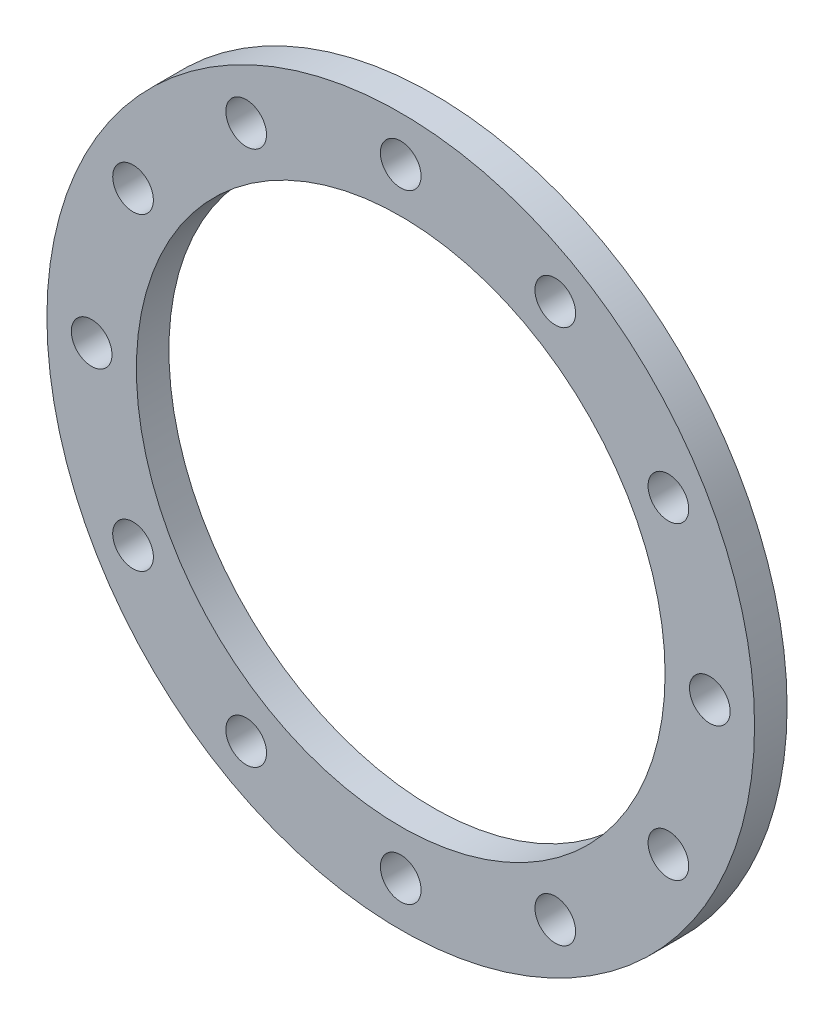
ISO-10303-21;
HEADER;
FILE_DESCRIPTION(('STEP AP214'),'2;1');
FILE_NAME('part.step','',(''),(''),'','','');
FILE_SCHEMA(('AUTOMOTIVE_DESIGN { 1 0 10303 214 1 1 1 1 }'));
ENDSEC;
DATA;
#1=APPLICATION_CONTEXT('core data for automotive mechanical design processes');
#2=APPLICATION_PROTOCOL_DEFINITION('international standard','automotive_design',2000,#1);
#3=PRODUCT_CONTEXT('',#1,'mechanical');
#4=PRODUCT('Part','Part','',(#3));
#5=PRODUCT_RELATED_PRODUCT_CATEGORY('part','',(#4));
#6=PRODUCT_DEFINITION_FORMATION('','',#4);
#7=PRODUCT_DEFINITION_CONTEXT('part definition',#1,'design');
#8=PRODUCT_DEFINITION('design','',#6,#7);
#9=PRODUCT_DEFINITION_SHAPE('','',#8);
#10=(LENGTH_UNIT() NAMED_UNIT(*) SI_UNIT(.MILLI.,.METRE.));
#11=(NAMED_UNIT(*) PLANE_ANGLE_UNIT() SI_UNIT($,.RADIAN.));
#12=(NAMED_UNIT(*) SI_UNIT($,.STERADIAN.) SOLID_ANGLE_UNIT());
#13=UNCERTAINTY_MEASURE_WITH_UNIT(LENGTH_MEASURE(1.E-05),#10,'distance_accuracy_value','');
#14=(GEOMETRIC_REPRESENTATION_CONTEXT(3) GLOBAL_UNCERTAINTY_ASSIGNED_CONTEXT((#13)) GLOBAL_UNIT_ASSIGNED_CONTEXT((#10,
#11,#12)) REPRESENTATION_CONTEXT('',''));
#15=CARTESIAN_POINT('',(0.,0.,0.));
#16=DIRECTION('',(0.,0.,1.));
#17=DIRECTION('',(1.,0.,0.));
#18=AXIS2_PLACEMENT_3D('',#15,#16,#17);
#19=CARTESIAN_POINT('',(0.,0.,4.));
#20=DIRECTION('',(0.,0.,1.));
#21=DIRECTION('',(1.,0.,0.));
#22=AXIS2_PLACEMENT_3D('',#19,#20,#21);
#23=PLANE('',#22);
#24=CARTESIAN_POINT('',(-32.9089653438087,18.9999999999999,4.));
#25=DIRECTION('',(0.,0.,1.));
#26=DIRECTION('',(0.499999999999998,0.86602540378444,0.));
#27=AXIS2_PLACEMENT_3D('',#24,#25,#26);
#28=CIRCLE('',#27,2.5);
#29=CARTESIAN_POINT('',(-31.6589653438087,21.165063509461,4.));
#30=VERTEX_POINT('',#29);
#31=EDGE_CURVE('E109',#30,#30,#28,.T.);
#32=ORIENTED_EDGE('',*,*,#31,.F.);
#33=EDGE_LOOP('',(#32));
#34=FACE_BOUND('',#33,.T.);
#35=CARTESIAN_POINT('',(-38.,-1.32676290876039E-13,4.));
#36=DIRECTION('',(0.,0.,1.));
#37=DIRECTION('',(0.,1.,0.));
#38=AXIS2_PLACEMENT_3D('',#35,#36,#37);
#39=CIRCLE('',#38,2.5);
#40=CARTESIAN_POINT('',(-38.,2.49999999999987,4.));
#41=VERTEX_POINT('',#40);
#42=EDGE_CURVE('E103',#41,#41,#39,.T.);
#43=ORIENTED_EDGE('',*,*,#42,.F.);
#44=EDGE_LOOP('',(#43));
#45=FACE_BOUND('',#44,.T.);
#46=CARTESIAN_POINT('',(-32.9089653438086,-19.0000000000002,4.));
#47=DIRECTION('',(0.,0.,1.));
#48=DIRECTION('',(-0.500000000000004,0.866025403784436,0.));
#49=AXIS2_PLACEMENT_3D('',#46,#47,#48);
#50=CIRCLE('',#49,2.5);
#51=CARTESIAN_POINT('',(-34.1589653438086,-16.8349364905391,4.));
#52=VERTEX_POINT('',#51);
#53=EDGE_CURVE('E97',#52,#52,#50,.T.);
#54=ORIENTED_EDGE('',*,*,#53,.F.);
#55=EDGE_LOOP('',(#54));
#56=FACE_BOUND('',#55,.T.);
#57=CARTESIAN_POINT('',(-18.9999999999998,-32.9089653438088,4.));
#58=DIRECTION('',(0.,0.,1.));
#59=DIRECTION('',(-0.866025403784442,0.499999999999995,0.));
#60=AXIS2_PLACEMENT_3D('',#57,#58,#59);
#61=CIRCLE('',#60,2.5);
#62=CARTESIAN_POINT('',(-21.1650635094609,-31.6589653438088,4.));
#63=VERTEX_POINT('',#62);
#64=EDGE_CURVE('E91',#63,#63,#61,.T.);
#65=ORIENTED_EDGE('',*,*,#64,.F.);
#66=EDGE_LOOP('',(#65));
#67=FACE_BOUND('',#66,.T.);
#68=CARTESIAN_POINT('',(0.,-38.,4.));
#69=DIRECTION('',(0.,0.,1.));
#70=DIRECTION('',(-1.,0.,0.));
#71=AXIS2_PLACEMENT_3D('',#68,#69,#70);
#72=CIRCLE('',#71,2.5);
#73=CARTESIAN_POINT('',(-2.5,-38.,4.));
#74=VERTEX_POINT('',#73);
#75=EDGE_CURVE('E85',#74,#74,#72,.T.);
#76=ORIENTED_EDGE('',*,*,#75,.F.);
#77=EDGE_LOOP('',(#76));
#78=FACE_BOUND('',#77,.T.);
#79=CARTESIAN_POINT('',(19.0000000000003,-32.9089653438085,4.));
#80=DIRECTION('',(0.,0.,1.));
#81=DIRECTION('',(-0.866025403784435,-0.500000000000007,0.));
#82=AXIS2_PLACEMENT_3D('',#79,#80,#81);
#83=CIRCLE('',#82,2.5);
#84=CARTESIAN_POINT('',(16.8349364905392,-34.1589653438085,4.));
#85=VERTEX_POINT('',#84);
#86=EDGE_CURVE('E79',#85,#85,#83,.T.);
#87=ORIENTED_EDGE('',*,*,#86,.F.);
#88=EDGE_LOOP('',(#87));
#89=FACE_BOUND('',#88,.T.);
#90=CARTESIAN_POINT('',(32.9089653438088,-18.9999999999997,4.));
#91=DIRECTION('',(0.,0.,1.));
#92=DIRECTION('',(-0.499999999999992,-0.866025403784443,0.));
#93=AXIS2_PLACEMENT_3D('',#90,#91,#92);
#94=CIRCLE('',#93,2.5);
#95=CARTESIAN_POINT('',(31.6589653438089,-21.1650635094608,4.));
#96=VERTEX_POINT('',#95);
#97=EDGE_CURVE('E73',#96,#96,#94,.T.);
#98=ORIENTED_EDGE('',*,*,#97,.F.);
#99=EDGE_LOOP('',(#98));
#100=FACE_BOUND('',#99,.T.);
#101=CARTESIAN_POINT('',(38.,3.98028872628117E-13,4.));
#102=DIRECTION('',(0.,0.,1.));
#103=DIRECTION('',(0.,-1.,0.));
#104=AXIS2_PLACEMENT_3D('',#101,#102,#103);
#105=CIRCLE('',#104,2.5);
#106=CARTESIAN_POINT('',(38.,-2.4999999999996,4.));
#107=VERTEX_POINT('',#106);
#108=EDGE_CURVE('E66',#107,#107,#105,.T.);
#109=ORIENTED_EDGE('',*,*,#108,.F.);
#110=EDGE_LOOP('',(#109));
#111=FACE_BOUND('',#110,.T.);
#112=CARTESIAN_POINT('',(32.9089653438084,19.0000000000004,4.));
#113=DIRECTION('',(0.,0.,1.));
#114=DIRECTION('',(0.50000000000001,-0.866025403784433,0.));
#115=AXIS2_PLACEMENT_3D('',#112,#113,#114);
#116=CIRCLE('',#115,2.5);
#117=CARTESIAN_POINT('',(34.1589653438085,16.8349364905393,4.));
#118=VERTEX_POINT('',#117);
#119=EDGE_CURVE('E120',#118,#118,#116,.T.);
#120=ORIENTED_EDGE('',*,*,#119,.F.);
#121=EDGE_LOOP('',(#120));
#122=FACE_BOUND('',#121,.T.);
#123=CARTESIAN_POINT('',(18.9999999999996,32.9089653438089,4.));
#124=DIRECTION('',(0.,0.,1.));
#125=DIRECTION('',(0.866025403784445,-0.499999999999989,0.));
#126=AXIS2_PLACEMENT_3D('',#123,#124,#125);
#127=CIRCLE('',#126,2.5);
#128=CARTESIAN_POINT('',(21.1650635094607,31.6589653438089,4.));
#129=VERTEX_POINT('',#128);
#130=EDGE_CURVE('E114',#129,#129,#127,.T.);
#131=ORIENTED_EDGE('',*,*,#130,.F.);
#132=EDGE_LOOP('',(#131));
#133=FACE_BOUND('',#132,.T.);
#134=CARTESIAN_POINT('',(-19.,32.9089653438086,4.));
#135=DIRECTION('',(0.,0.,1.));
#136=DIRECTION('',(0.866025403784438,0.500000000000001,0.));
#137=AXIS2_PLACEMENT_3D('',#134,#135,#136);
#138=CIRCLE('',#137,2.5);
#139=CARTESIAN_POINT('',(-16.8349364905389,34.1589653438086,4.));
#140=VERTEX_POINT('',#139);
#141=EDGE_CURVE('E60',#140,#140,#138,.T.);
#142=ORIENTED_EDGE('',*,*,#141,.F.);
#143=EDGE_LOOP('',(#142));
#144=FACE_BOUND('',#143,.T.);
#145=CARTESIAN_POINT('',(0.,38.,4.));
#146=DIRECTION('',(0.,0.,1.));
#147=DIRECTION('',(1.,0.,0.));
#148=AXIS2_PLACEMENT_3D('',#145,#146,#147);
#149=CIRCLE('',#148,2.5);
#150=CARTESIAN_POINT('',(2.5,38.,4.));
#151=VERTEX_POINT('',#150);
#152=EDGE_CURVE('E54',#151,#151,#149,.T.);
#153=ORIENTED_EDGE('',*,*,#152,.F.);
#154=EDGE_LOOP('',(#153));
#155=FACE_BOUND('',#154,.T.);
#156=CARTESIAN_POINT('',(0.,0.,4.));
#157=DIRECTION('',(0.,0.,1.));
#158=DIRECTION('',(1.,0.,0.));
#159=AXIS2_PLACEMENT_3D('',#156,#157,#158);
#160=CIRCLE('',#159,43.5);
#161=CARTESIAN_POINT('',(43.5,0.,4.));
#162=VERTEX_POINT('',#161);
#163=EDGE_CURVE('E10',#162,#162,#160,.T.);
#164=ORIENTED_EDGE('',*,*,#163,.T.);
#165=EDGE_LOOP('',(#164));
#166=FACE_BOUND('',#165,.T.);
#167=CARTESIAN_POINT('',(0.,0.,4.));
#168=DIRECTION('',(0.,0.,1.));
#169=DIRECTION('',(1.,0.,0.));
#170=AXIS2_PLACEMENT_3D('',#167,#168,#169);
#171=CIRCLE('',#170,32.5);
#172=CARTESIAN_POINT('',(32.5,0.,4.));
#173=VERTEX_POINT('',#172);
#174=EDGE_CURVE('E46',#173,#173,#171,.T.);
#175=ORIENTED_EDGE('',*,*,#174,.F.);
#176=EDGE_LOOP('',(#175));
#177=FACE_BOUND('',#176,.T.);
#178=ADVANCED_FACE('F35',(#34,#45,#56,#67,#78,#89,#100,#111,#122,#133,#144,#155,#166,#177),#23,.T.);
#179=CARTESIAN_POINT('',(0.,0.,0.));
#180=DIRECTION('',(0.,0.,1.));
#181=DIRECTION('',(1.,0.,0.));
#182=AXIS2_PLACEMENT_3D('',#179,#180,#181);
#183=PLANE('',#182);
#184=CARTESIAN_POINT('',(-32.9089653438087,18.9999999999999,0.));
#185=DIRECTION('',(0.,0.,1.));
#186=DIRECTION('',(0.499999999999998,0.86602540378444,0.));
#187=AXIS2_PLACEMENT_3D('',#184,#185,#186);
#188=CIRCLE('',#187,2.5);
#189=CARTESIAN_POINT('',(-31.6589653438087,21.165063509461,0.));
#190=VERTEX_POINT('',#189);
#191=EDGE_CURVE('E63',#190,#190,#188,.T.);
#192=ORIENTED_EDGE('',*,*,#191,.T.);
#193=EDGE_LOOP('',(#192));
#194=FACE_BOUND('',#193,.T.);
#195=CARTESIAN_POINT('',(-38.,-1.32676290876039E-13,0.));
#196=DIRECTION('',(0.,0.,1.));
#197=DIRECTION('',(0.,1.,0.));
#198=AXIS2_PLACEMENT_3D('',#195,#196,#197);
#199=CIRCLE('',#198,2.5);
#200=CARTESIAN_POINT('',(-38.,2.49999999999987,0.));
#201=VERTEX_POINT('',#200);
#202=EDGE_CURVE('E106',#201,#201,#199,.T.);
#203=ORIENTED_EDGE('',*,*,#202,.T.);
#204=EDGE_LOOP('',(#203));
#205=FACE_BOUND('',#204,.T.);
#206=CARTESIAN_POINT('',(-32.9089653438086,-19.0000000000002,0.));
#207=DIRECTION('',(0.,0.,1.));
#208=DIRECTION('',(-0.500000000000004,0.866025403784436,0.));
#209=AXIS2_PLACEMENT_3D('',#206,#207,#208);
#210=CIRCLE('',#209,2.5);
#211=CARTESIAN_POINT('',(-34.1589653438086,-16.8349364905391,0.));
#212=VERTEX_POINT('',#211);
#213=EDGE_CURVE('E100',#212,#212,#210,.T.);
#214=ORIENTED_EDGE('',*,*,#213,.T.);
#215=EDGE_LOOP('',(#214));
#216=FACE_BOUND('',#215,.T.);
#217=CARTESIAN_POINT('',(-18.9999999999998,-32.9089653438088,0.));
#218=DIRECTION('',(0.,0.,1.));
#219=DIRECTION('',(-0.866025403784442,0.499999999999995,0.));
#220=AXIS2_PLACEMENT_3D('',#217,#218,#219);
#221=CIRCLE('',#220,2.5);
#222=CARTESIAN_POINT('',(-21.1650635094609,-31.6589653438088,0.));
#223=VERTEX_POINT('',#222);
#224=EDGE_CURVE('E94',#223,#223,#221,.T.);
#225=ORIENTED_EDGE('',*,*,#224,.T.);
#226=EDGE_LOOP('',(#225));
#227=FACE_BOUND('',#226,.T.);
#228=CARTESIAN_POINT('',(0.,-38.,0.));
#229=DIRECTION('',(0.,0.,1.));
#230=DIRECTION('',(-1.,0.,0.));
#231=AXIS2_PLACEMENT_3D('',#228,#229,#230);
#232=CIRCLE('',#231,2.5);
#233=CARTESIAN_POINT('',(-2.5,-38.,0.));
#234=VERTEX_POINT('',#233);
#235=EDGE_CURVE('E88',#234,#234,#232,.T.);
#236=ORIENTED_EDGE('',*,*,#235,.T.);
#237=EDGE_LOOP('',(#236));
#238=FACE_BOUND('',#237,.T.);
#239=CARTESIAN_POINT('',(19.0000000000003,-32.9089653438085,0.));
#240=DIRECTION('',(0.,0.,1.));
#241=DIRECTION('',(-0.866025403784435,-0.500000000000007,0.));
#242=AXIS2_PLACEMENT_3D('',#239,#240,#241);
#243=CIRCLE('',#242,2.5);
#244=CARTESIAN_POINT('',(16.8349364905392,-34.1589653438085,0.));
#245=VERTEX_POINT('',#244);
#246=EDGE_CURVE('E82',#245,#245,#243,.T.);
#247=ORIENTED_EDGE('',*,*,#246,.T.);
#248=EDGE_LOOP('',(#247));
#249=FACE_BOUND('',#248,.T.);
#250=CARTESIAN_POINT('',(32.9089653438088,-18.9999999999997,0.));
#251=DIRECTION('',(0.,0.,1.));
#252=DIRECTION('',(-0.499999999999992,-0.866025403784443,0.));
#253=AXIS2_PLACEMENT_3D('',#250,#251,#252);
#254=CIRCLE('',#253,2.5);
#255=CARTESIAN_POINT('',(31.6589653438089,-21.1650635094608,0.));
#256=VERTEX_POINT('',#255);
#257=EDGE_CURVE('E76',#256,#256,#254,.T.);
#258=ORIENTED_EDGE('',*,*,#257,.T.);
#259=EDGE_LOOP('',(#258));
#260=FACE_BOUND('',#259,.T.);
#261=CARTESIAN_POINT('',(38.,3.98028872628117E-13,0.));
#262=DIRECTION('',(0.,0.,1.));
#263=DIRECTION('',(0.,-1.,0.));
#264=AXIS2_PLACEMENT_3D('',#261,#262,#263);
#265=CIRCLE('',#264,2.5);
#266=CARTESIAN_POINT('',(38.,-2.4999999999996,0.));
#267=VERTEX_POINT('',#266);
#268=EDGE_CURVE('E69',#267,#267,#265,.T.);
#269=ORIENTED_EDGE('',*,*,#268,.T.);
#270=EDGE_LOOP('',(#269));
#271=FACE_BOUND('',#270,.T.);
#272=CARTESIAN_POINT('',(32.9089653438084,19.0000000000004,0.));
#273=DIRECTION('',(0.,0.,1.));
#274=DIRECTION('',(0.50000000000001,-0.866025403784433,0.));
#275=AXIS2_PLACEMENT_3D('',#272,#273,#274);
#276=CIRCLE('',#275,2.5);
#277=CARTESIAN_POINT('',(34.1589653438085,16.8349364905393,0.));
#278=VERTEX_POINT('',#277);
#279=EDGE_CURVE('E70',#278,#278,#276,.T.);
#280=ORIENTED_EDGE('',*,*,#279,.T.);
#281=EDGE_LOOP('',(#280));
#282=FACE_BOUND('',#281,.T.);
#283=CARTESIAN_POINT('',(18.9999999999996,32.9089653438089,0.));
#284=DIRECTION('',(0.,0.,1.));
#285=DIRECTION('',(0.866025403784445,-0.499999999999989,0.));
#286=AXIS2_PLACEMENT_3D('',#283,#284,#285);
#287=CIRCLE('',#286,2.5);
#288=CARTESIAN_POINT('',(21.1650635094607,31.6589653438089,0.));
#289=VERTEX_POINT('',#288);
#290=EDGE_CURVE('E117',#289,#289,#287,.T.);
#291=ORIENTED_EDGE('',*,*,#290,.T.);
#292=EDGE_LOOP('',(#291));
#293=FACE_BOUND('',#292,.T.);
#294=CARTESIAN_POINT('',(-19.,32.9089653438086,0.));
#295=DIRECTION('',(0.,0.,1.));
#296=DIRECTION('',(0.866025403784438,0.500000000000001,0.));
#297=AXIS2_PLACEMENT_3D('',#294,#295,#296);
#298=CIRCLE('',#297,2.5);
#299=CARTESIAN_POINT('',(-16.8349364905389,34.1589653438086,0.));
#300=VERTEX_POINT('',#299);
#301=EDGE_CURVE('E57',#300,#300,#298,.T.);
#302=ORIENTED_EDGE('',*,*,#301,.T.);
#303=EDGE_LOOP('',(#302));
#304=FACE_BOUND('',#303,.T.);
#305=CARTESIAN_POINT('',(0.,38.,0.));
#306=DIRECTION('',(0.,0.,1.));
#307=DIRECTION('',(1.,0.,0.));
#308=AXIS2_PLACEMENT_3D('',#305,#306,#307);
#309=CIRCLE('',#308,2.5);
#310=CARTESIAN_POINT('',(2.5,38.,0.));
#311=VERTEX_POINT('',#310);
#312=EDGE_CURVE('E51',#311,#311,#309,.T.);
#313=ORIENTED_EDGE('',*,*,#312,.T.);
#314=EDGE_LOOP('',(#313));
#315=FACE_BOUND('',#314,.T.);
#316=CARTESIAN_POINT('',(0.,0.,0.));
#317=DIRECTION('',(0.,0.,1.));
#318=DIRECTION('',(1.,0.,0.));
#319=AXIS2_PLACEMENT_3D('',#316,#317,#318);
#320=CIRCLE('',#319,43.5);
#321=CARTESIAN_POINT('',(43.5,0.,0.));
#322=VERTEX_POINT('',#321);
#323=EDGE_CURVE('E39',#322,#322,#320,.T.);
#324=ORIENTED_EDGE('',*,*,#323,.F.);
#325=EDGE_LOOP('',(#324));
#326=FACE_BOUND('',#325,.T.);
#327=CARTESIAN_POINT('',(0.,0.,0.));
#328=DIRECTION('',(0.,0.,1.));
#329=DIRECTION('',(1.,0.,0.));
#330=AXIS2_PLACEMENT_3D('',#327,#328,#329);
#331=CIRCLE('',#330,32.5);
#332=CARTESIAN_POINT('',(32.5,0.,0.));
#333=VERTEX_POINT('',#332);
#334=EDGE_CURVE('E48',#333,#333,#331,.T.);
#335=ORIENTED_EDGE('',*,*,#334,.T.);
#336=EDGE_LOOP('',(#335));
#337=FACE_BOUND('',#336,.T.);
#338=ADVANCED_FACE('F126',(#194,#205,#216,#227,#238,#249,#260,#271,#282,#293,#304,#315,#326,
#337),#183,.F.);
#339=CARTESIAN_POINT('',(0.,0.,4.));
#340=DIRECTION('',(0.,0.,-1.));
#341=DIRECTION('',(-1.,0.,0.));
#342=AXIS2_PLACEMENT_3D('',#339,#340,#341);
#343=CYLINDRICAL_SURFACE('',#342,43.5);
#344=ORIENTED_EDGE('',*,*,#163,.F.);
#345=EDGE_LOOP('',(#344));
#346=FACE_BOUND('',#345,.T.);
#347=ORIENTED_EDGE('',*,*,#323,.T.);
#348=EDGE_LOOP('',(#347));
#349=FACE_BOUND('',#348,.T.);
#350=ADVANCED_FACE('F37',(#346,#349),#343,.T.);
#351=CARTESIAN_POINT('',(0.,0.,4.));
#352=DIRECTION('',(0.,0.,-1.));
#353=DIRECTION('',(-1.,0.,0.));
#354=AXIS2_PLACEMENT_3D('',#351,#352,#353);
#355=CYLINDRICAL_SURFACE('',#354,32.5);
#356=ORIENTED_EDGE('',*,*,#174,.T.);
#357=EDGE_LOOP('',(#356));
#358=FACE_BOUND('',#357,.T.);
#359=ORIENTED_EDGE('',*,*,#334,.F.);
#360=EDGE_LOOP('',(#359));
#361=FACE_BOUND('',#360,.T.);
#362=ADVANCED_FACE('F149',(#358,#361),#355,.F.);
#363=CARTESIAN_POINT('',(0.,38.,0.));
#364=DIRECTION('',(0.,0.,1.));
#365=DIRECTION('',(1.,0.,0.));
#366=AXIS2_PLACEMENT_3D('',#363,#364,#365);
#367=CYLINDRICAL_SURFACE('',#366,2.5);
#368=ORIENTED_EDGE('',*,*,#312,.F.);
#369=EDGE_LOOP('',(#368));
#370=FACE_BOUND('',#369,.T.);
#371=ORIENTED_EDGE('',*,*,#152,.T.);
#372=EDGE_LOOP('',(#371));
#373=FACE_BOUND('',#372,.T.);
#374=ADVANCED_FACE('F152',(#370,#373),#367,.F.);
#375=CARTESIAN_POINT('',(-19.,32.9089653438086,0.));
#376=DIRECTION('',(0.,0.,1.));
#377=DIRECTION('',(1.,0.,0.));
#378=AXIS2_PLACEMENT_3D('',#375,#376,#377);
#379=CYLINDRICAL_SURFACE('',#378,2.5);
#380=ORIENTED_EDGE('',*,*,#301,.F.);
#381=EDGE_LOOP('',(#380));
#382=FACE_BOUND('',#381,.T.);
#383=ORIENTED_EDGE('',*,*,#141,.T.);
#384=EDGE_LOOP('',(#383));
#385=FACE_BOUND('',#384,.T.);
#386=ADVANCED_FACE('F166',(#382,#385),#379,.F.);
#387=CARTESIAN_POINT('',(18.9999999999996,32.9089653438089,0.));
#388=DIRECTION('',(0.,0.,1.));
#389=DIRECTION('',(1.,0.,0.));
#390=AXIS2_PLACEMENT_3D('',#387,#388,#389);
#391=CYLINDRICAL_SURFACE('',#390,2.5);
#392=ORIENTED_EDGE('',*,*,#290,.F.);
#393=EDGE_LOOP('',(#392));
#394=FACE_BOUND('',#393,.T.);
#395=ORIENTED_EDGE('',*,*,#130,.T.);
#396=EDGE_LOOP('',(#395));
#397=FACE_BOUND('',#396,.T.);
#398=ADVANCED_FACE('F133',(#394,#397),#391,.F.);
#399=CARTESIAN_POINT('',(32.9089653438084,19.0000000000004,0.));
#400=DIRECTION('',(0.,0.,1.));
#401=DIRECTION('',(1.,0.,0.));
#402=AXIS2_PLACEMENT_3D('',#399,#400,#401);
#403=CYLINDRICAL_SURFACE('',#402,2.5);
#404=ORIENTED_EDGE('',*,*,#279,.F.);
#405=EDGE_LOOP('',(#404));
#406=FACE_BOUND('',#405,.T.);
#407=ORIENTED_EDGE('',*,*,#119,.T.);
#408=EDGE_LOOP('',(#407));
#409=FACE_BOUND('',#408,.T.);
#410=ADVANCED_FACE('F129',(#406,#409),#403,.F.);
#411=CARTESIAN_POINT('',(38.,3.98028872628117E-13,0.));
#412=DIRECTION('',(0.,0.,1.));
#413=DIRECTION('',(1.,0.,0.));
#414=AXIS2_PLACEMENT_3D('',#411,#412,#413);
#415=CYLINDRICAL_SURFACE('',#414,2.5);
#416=ORIENTED_EDGE('',*,*,#268,.F.);
#417=EDGE_LOOP('',(#416));
#418=FACE_BOUND('',#417,.T.);
#419=ORIENTED_EDGE('',*,*,#108,.T.);
#420=EDGE_LOOP('',(#419));
#421=FACE_BOUND('',#420,.T.);
#422=ADVANCED_FACE('F132',(#418,#421),#415,.F.);
#423=CARTESIAN_POINT('',(32.9089653438088,-18.9999999999997,0.));
#424=DIRECTION('',(0.,0.,1.));
#425=DIRECTION('',(1.,0.,0.));
#426=AXIS2_PLACEMENT_3D('',#423,#424,#425);
#427=CYLINDRICAL_SURFACE('',#426,2.5);
#428=ORIENTED_EDGE('',*,*,#257,.F.);
#429=EDGE_LOOP('',(#428));
#430=FACE_BOUND('',#429,.T.);
#431=ORIENTED_EDGE('',*,*,#97,.T.);
#432=EDGE_LOOP('',(#431));
#433=FACE_BOUND('',#432,.T.);
#434=ADVANCED_FACE('F173',(#430,#433),#427,.F.);
#435=CARTESIAN_POINT('',(19.0000000000003,-32.9089653438085,0.));
#436=DIRECTION('',(0.,0.,1.));
#437=DIRECTION('',(1.,0.,0.));
#438=AXIS2_PLACEMENT_3D('',#435,#436,#437);
#439=CYLINDRICAL_SURFACE('',#438,2.5);
#440=ORIENTED_EDGE('',*,*,#246,.F.);
#441=EDGE_LOOP('',(#440));
#442=FACE_BOUND('',#441,.T.);
#443=ORIENTED_EDGE('',*,*,#86,.T.);
#444=EDGE_LOOP('',(#443));
#445=FACE_BOUND('',#444,.T.);
#446=ADVANCED_FACE('F177',(#442,#445),#439,.F.);
#447=CARTESIAN_POINT('',(0.,-38.,0.));
#448=DIRECTION('',(0.,0.,1.));
#449=DIRECTION('',(1.,0.,0.));
#450=AXIS2_PLACEMENT_3D('',#447,#448,#449);
#451=CYLINDRICAL_SURFACE('',#450,2.5);
#452=ORIENTED_EDGE('',*,*,#235,.F.);
#453=EDGE_LOOP('',(#452));
#454=FACE_BOUND('',#453,.T.);
#455=ORIENTED_EDGE('',*,*,#75,.T.);
#456=EDGE_LOOP('',(#455));
#457=FACE_BOUND('',#456,.T.);
#458=ADVANCED_FACE('F181',(#454,#457),#451,.F.);
#459=CARTESIAN_POINT('',(-18.9999999999998,-32.9089653438088,0.));
#460=DIRECTION('',(0.,0.,1.));
#461=DIRECTION('',(1.,0.,0.));
#462=AXIS2_PLACEMENT_3D('',#459,#460,#461);
#463=CYLINDRICAL_SURFACE('',#462,2.5);
#464=ORIENTED_EDGE('',*,*,#224,.F.);
#465=EDGE_LOOP('',(#464));
#466=FACE_BOUND('',#465,.T.);
#467=ORIENTED_EDGE('',*,*,#64,.T.);
#468=EDGE_LOOP('',(#467));
#469=FACE_BOUND('',#468,.T.);
#470=ADVANCED_FACE('F185',(#466,#469),#463,.F.);
#471=CARTESIAN_POINT('',(-32.9089653438086,-19.0000000000002,0.));
#472=DIRECTION('',(0.,0.,1.));
#473=DIRECTION('',(1.,0.,0.));
#474=AXIS2_PLACEMENT_3D('',#471,#472,#473);
#475=CYLINDRICAL_SURFACE('',#474,2.5);
#476=ORIENTED_EDGE('',*,*,#213,.F.);
#477=EDGE_LOOP('',(#476));
#478=FACE_BOUND('',#477,.T.);
#479=ORIENTED_EDGE('',*,*,#53,.T.);
#480=EDGE_LOOP('',(#479));
#481=FACE_BOUND('',#480,.T.);
#482=ADVANCED_FACE('F189',(#478,#481),#475,.F.);
#483=CARTESIAN_POINT('',(-38.,-1.32676290876039E-13,0.));
#484=DIRECTION('',(0.,0.,1.));
#485=DIRECTION('',(1.,0.,0.));
#486=AXIS2_PLACEMENT_3D('',#483,#484,#485);
#487=CYLINDRICAL_SURFACE('',#486,2.5);
#488=ORIENTED_EDGE('',*,*,#202,.F.);
#489=EDGE_LOOP('',(#488));
#490=FACE_BOUND('',#489,.T.);
#491=ORIENTED_EDGE('',*,*,#42,.T.);
#492=EDGE_LOOP('',(#491));
#493=FACE_BOUND('',#492,.T.);
#494=ADVANCED_FACE('F193',(#490,#493),#487,.F.);
#495=CARTESIAN_POINT('',(-32.9089653438087,18.9999999999999,0.));
#496=DIRECTION('',(0.,0.,1.));
#497=DIRECTION('',(1.,0.,0.));
#498=AXIS2_PLACEMENT_3D('',#495,#496,#497);
#499=CYLINDRICAL_SURFACE('',#498,2.5);
#500=ORIENTED_EDGE('',*,*,#191,.F.);
#501=EDGE_LOOP('',(#500));
#502=FACE_BOUND('',#501,.T.);
#503=ORIENTED_EDGE('',*,*,#31,.T.);
#504=EDGE_LOOP('',(#503));
#505=FACE_BOUND('',#504,.T.);
#506=ADVANCED_FACE('F197',(#502,#505),#499,.F.);
#507=CLOSED_SHELL('',(#178,#338,#350,#362,#374,#386,#398,#410,#422,#434,#446,#458,#470,#482,
#494,#506));
#508=MANIFOLD_SOLID_BREP('B2',#507);
#509=ADVANCED_BREP_SHAPE_REPRESENTATION('',(#18,#508),#14);
#510=SHAPE_DEFINITION_REPRESENTATION(#9,#509);
ENDSEC;
END-ISO-10303-21;
